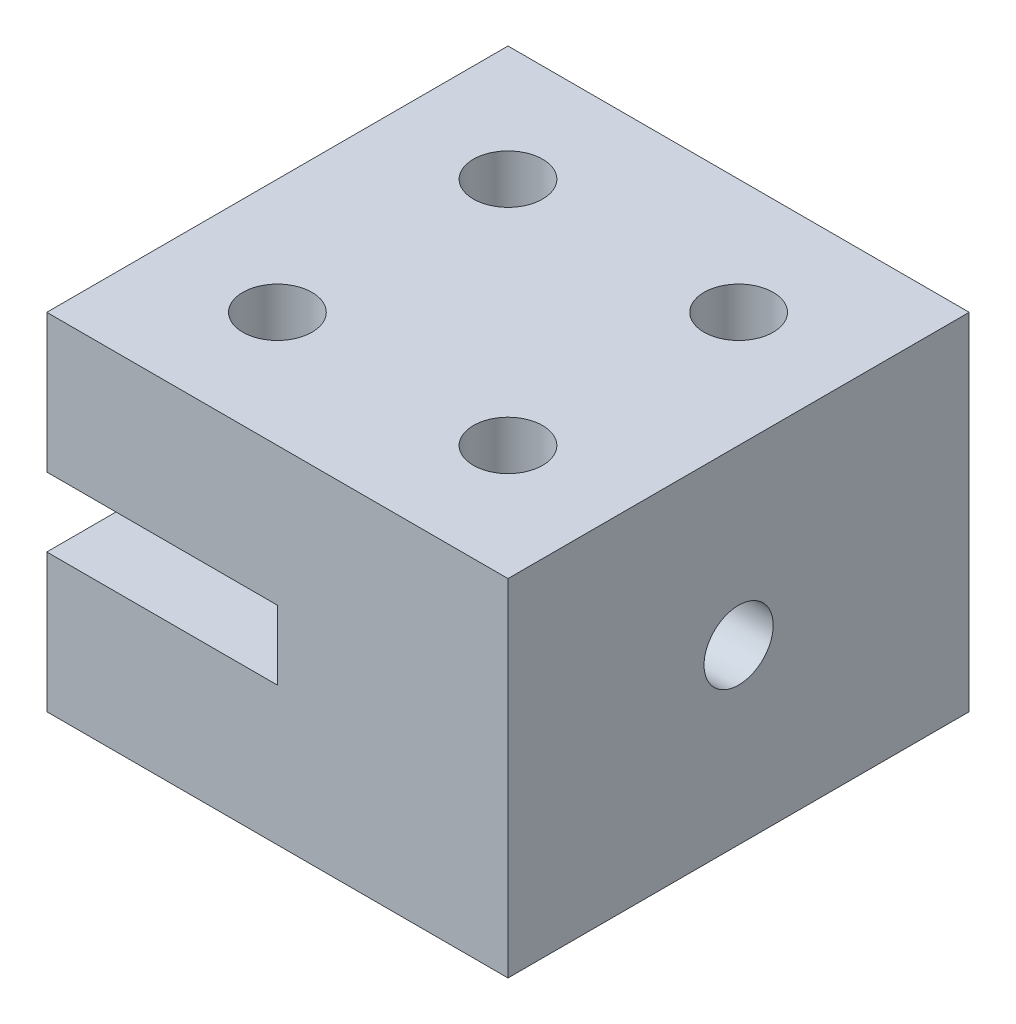
ISO-10303-21;
HEADER;
FILE_DESCRIPTION(('STEP AP214'),'2;1');
FILE_NAME('part.step','',(''),(''),'','','');
FILE_SCHEMA(('AUTOMOTIVE_DESIGN { 1 0 10303 214 1 1 1 1 }'));
ENDSEC;
DATA;
#1=APPLICATION_CONTEXT('core data for automotive mechanical design processes');
#2=APPLICATION_PROTOCOL_DEFINITION('international standard','automotive_design',2000,#1);
#3=PRODUCT_CONTEXT('',#1,'mechanical');
#4=PRODUCT('Part','Part','',(#3));
#5=PRODUCT_RELATED_PRODUCT_CATEGORY('part','',(#4));
#6=PRODUCT_DEFINITION_FORMATION('','',#4);
#7=PRODUCT_DEFINITION_CONTEXT('part definition',#1,'design');
#8=PRODUCT_DEFINITION('design','',#6,#7);
#9=PRODUCT_DEFINITION_SHAPE('','',#8);
#10=(LENGTH_UNIT() NAMED_UNIT(*) SI_UNIT(.MILLI.,.METRE.));
#11=(NAMED_UNIT(*) PLANE_ANGLE_UNIT() SI_UNIT($,.RADIAN.));
#12=(NAMED_UNIT(*) SI_UNIT($,.STERADIAN.) SOLID_ANGLE_UNIT());
#13=UNCERTAINTY_MEASURE_WITH_UNIT(LENGTH_MEASURE(1.E-05),#10,'distance_accuracy_value','');
#14=(GEOMETRIC_REPRESENTATION_CONTEXT(3) GLOBAL_UNCERTAINTY_ASSIGNED_CONTEXT((#13)) GLOBAL_UNIT_ASSIGNED_CONTEXT((#10,
#11,#12)) REPRESENTATION_CONTEXT('',''));
#15=CARTESIAN_POINT('',(0.,0.,0.));
#16=DIRECTION('',(0.,0.,1.));
#17=DIRECTION('',(1.,0.,0.));
#18=AXIS2_PLACEMENT_3D('',#15,#16,#17);
#19=CARTESIAN_POINT('',(9.99999999999999,7.5,-10.));
#20=DIRECTION('',(-1.,0.,0.));
#21=DIRECTION('',(0.,0.,1.));
#22=AXIS2_PLACEMENT_3D('',#19,#20,#21);
#23=PLANE('',#22);
#24=CARTESIAN_POINT('',(9.99999999999999,0.,0.));
#25=DIRECTION('',(1.,0.,0.));
#26=DIRECTION('',(0.,0.,-1.));
#27=AXIS2_PLACEMENT_3D('',#24,#25,#26);
#28=CIRCLE('',#27,1.5);
#29=CARTESIAN_POINT('',(9.99999999999999,0.,-1.5));
#30=VERTEX_POINT('',#29);
#31=EDGE_CURVE('E150',#30,#30,#28,.T.);
#32=ORIENTED_EDGE('',*,*,#31,.F.);
#33=EDGE_LOOP('',(#32));
#34=FACE_BOUND('',#33,.T.);
#35=DIRECTION('',(0.,-1.,0.));
#36=VECTOR('',#35,1.);
#37=CARTESIAN_POINT('',(9.99999999999999,7.5,-10.));
#38=LINE('',#37,#36);
#39=CARTESIAN_POINT('',(9.99999999999999,7.5,-10.));
#40=VERTEX_POINT('',#39);
#41=CARTESIAN_POINT('',(9.99999999999999,-7.5,-10.));
#42=VERTEX_POINT('',#41);
#43=EDGE_CURVE('E75',#40,#42,#38,.T.);
#44=ORIENTED_EDGE('',*,*,#43,.F.);
#45=DIRECTION('',(0.,0.,-1.));
#46=VECTOR('',#45,1.);
#47=CARTESIAN_POINT('',(9.99999999999999,7.5,-10.));
#48=LINE('',#47,#46);
#49=CARTESIAN_POINT('',(9.99999999999999,7.5,10.));
#50=VERTEX_POINT('',#49);
#51=EDGE_CURVE('E139',#50,#40,#48,.T.);
#52=ORIENTED_EDGE('',*,*,#51,.F.);
#53=DIRECTION('',(0.,-1.,0.));
#54=VECTOR('',#53,1.);
#55=CARTESIAN_POINT('',(9.99999999999999,7.5,10.));
#56=LINE('',#55,#54);
#57=CARTESIAN_POINT('',(9.99999999999999,-7.5,10.));
#58=VERTEX_POINT('',#57);
#59=EDGE_CURVE('E100',#50,#58,#56,.T.);
#60=ORIENTED_EDGE('',*,*,#59,.T.);
#61=DIRECTION('',(0.,0.,-1.));
#62=VECTOR('',#61,1.);
#63=CARTESIAN_POINT('',(9.99999999999999,-7.5,-10.));
#64=LINE('',#63,#62);
#65=EDGE_CURVE('E89',#58,#42,#64,.T.);
#66=ORIENTED_EDGE('',*,*,#65,.T.);
#67=EDGE_LOOP('',(#44,#52,#60,#66));
#68=FACE_BOUND('',#67,.T.);
#69=ADVANCED_FACE('F33',(#34,#68),#23,.F.);
#70=CARTESIAN_POINT('',(-10.,7.5,-10.));
#71=DIRECTION('',(0.,0.,1.));
#72=DIRECTION('',(1.,0.,0.));
#73=AXIS2_PLACEMENT_3D('',#70,#71,#72);
#74=PLANE('',#73);
#75=DIRECTION('',(-1.,0.,0.));
#76=VECTOR('',#75,1.);
#77=CARTESIAN_POINT('',(-10.,-1.5,-10.));
#78=LINE('',#77,#76);
#79=CARTESIAN_POINT('',(0.,-1.5,-10.));
#80=VERTEX_POINT('',#79);
#81=CARTESIAN_POINT('',(-10.,-1.5,-10.));
#82=VERTEX_POINT('',#81);
#83=EDGE_CURVE('E107',#80,#82,#78,.T.);
#84=ORIENTED_EDGE('',*,*,#83,.F.);
#85=DIRECTION('',(0.,-1.,0.));
#86=VECTOR('',#85,1.);
#87=CARTESIAN_POINT('',(0.,1.5,-10.));
#88=LINE('',#87,#86);
#89=CARTESIAN_POINT('',(0.,1.5,-10.));
#90=VERTEX_POINT('',#89);
#91=EDGE_CURVE('E119',#90,#80,#88,.T.);
#92=ORIENTED_EDGE('',*,*,#91,.F.);
#93=DIRECTION('',(-1.,0.,0.));
#94=VECTOR('',#93,1.);
#95=CARTESIAN_POINT('',(-10.,1.5,-10.));
#96=LINE('',#95,#94);
#97=CARTESIAN_POINT('',(-10.,1.5,-10.));
#98=VERTEX_POINT('',#97);
#99=EDGE_CURVE('E147',#90,#98,#96,.T.);
#100=ORIENTED_EDGE('',*,*,#99,.T.);
#101=DIRECTION('',(0.,-1.,0.));
#102=VECTOR('',#101,1.);
#103=CARTESIAN_POINT('',(-10.,7.5,-10.));
#104=LINE('',#103,#102);
#105=CARTESIAN_POINT('',(-10.,7.5,-10.));
#106=VERTEX_POINT('',#105);
#107=EDGE_CURVE('E124',#106,#98,#104,.T.);
#108=ORIENTED_EDGE('',*,*,#107,.F.);
#109=DIRECTION('',(-1.,0.,0.));
#110=VECTOR('',#109,1.);
#111=CARTESIAN_POINT('',(-10.,7.5,-10.));
#112=LINE('',#111,#110);
#113=EDGE_CURVE('E84',#40,#106,#112,.T.);
#114=ORIENTED_EDGE('',*,*,#113,.F.);
#115=ORIENTED_EDGE('',*,*,#43,.T.);
#116=DIRECTION('',(-1.,0.,0.));
#117=VECTOR('',#116,1.);
#118=CARTESIAN_POINT('',(-10.,-7.5,-10.));
#119=LINE('',#118,#117);
#120=CARTESIAN_POINT('',(-10.,-7.5,-10.));
#121=VERTEX_POINT('',#120);
#122=EDGE_CURVE('E79',#42,#121,#119,.T.);
#123=ORIENTED_EDGE('',*,*,#122,.T.);
#124=DIRECTION('',(0.,-1.,0.));
#125=VECTOR('',#124,1.);
#126=CARTESIAN_POINT('',(-10.,7.5,-10.));
#127=LINE('',#126,#125);
#128=EDGE_CURVE('E97',#82,#121,#127,.T.);
#129=ORIENTED_EDGE('',*,*,#128,.F.);
#130=EDGE_LOOP('',(#84,#92,#100,#108,#114,#115,#123,#129));
#131=FACE_BOUND('',#130,.T.);
#132=ADVANCED_FACE('F77',(#131),#74,.F.);
#133=CARTESIAN_POINT('',(-10.,7.5,-10.));
#134=DIRECTION('',(1.,0.,0.));
#135=DIRECTION('',(0.,0.,-1.));
#136=AXIS2_PLACEMENT_3D('',#133,#134,#135);
#137=PLANE('',#136);
#138=DIRECTION('',(0.,0.,1.));
#139=VECTOR('',#138,1.);
#140=CARTESIAN_POINT('',(-10.,-1.5,-10.));
#141=LINE('',#140,#139);
#142=CARTESIAN_POINT('',(-10.,-1.5,10.));
#143=VERTEX_POINT('',#142);
#144=EDGE_CURVE('E41',#82,#143,#141,.T.);
#145=ORIENTED_EDGE('',*,*,#144,.F.);
#146=ORIENTED_EDGE('',*,*,#128,.T.);
#147=DIRECTION('',(0.,0.,1.));
#148=VECTOR('',#147,1.);
#149=CARTESIAN_POINT('',(-10.,-7.5,-10.));
#150=LINE('',#149,#148);
#151=CARTESIAN_POINT('',(-10.,-7.5,10.));
#152=VERTEX_POINT('',#151);
#153=EDGE_CURVE('E96',#121,#152,#150,.T.);
#154=ORIENTED_EDGE('',*,*,#153,.T.);
#155=DIRECTION('',(0.,-1.,0.));
#156=VECTOR('',#155,1.);
#157=CARTESIAN_POINT('',(-10.,7.5,10.));
#158=LINE('',#157,#156);
#159=EDGE_CURVE('E111',#143,#152,#158,.T.);
#160=ORIENTED_EDGE('',*,*,#159,.F.);
#161=EDGE_LOOP('',(#145,#146,#154,#160));
#162=FACE_BOUND('',#161,.T.);
#163=ADVANCED_FACE('F226',(#162),#137,.F.);
#164=CARTESIAN_POINT('',(-10.,7.5,10.));
#165=DIRECTION('',(0.,0.,-1.));
#166=DIRECTION('',(-1.,0.,0.));
#167=AXIS2_PLACEMENT_3D('',#164,#165,#166);
#168=PLANE('',#167);
#169=DIRECTION('',(1.,0.,0.));
#170=VECTOR('',#169,1.);
#171=CARTESIAN_POINT('',(-10.,-1.5,10.));
#172=LINE('',#171,#170);
#173=CARTESIAN_POINT('',(0.,-1.5,10.));
#174=VERTEX_POINT('',#173);
#175=EDGE_CURVE('E11',#143,#174,#172,.T.);
#176=ORIENTED_EDGE('',*,*,#175,.F.);
#177=ORIENTED_EDGE('',*,*,#159,.T.);
#178=DIRECTION('',(1.,0.,0.));
#179=VECTOR('',#178,1.);
#180=CARTESIAN_POINT('',(-10.,-7.5,10.));
#181=LINE('',#180,#179);
#182=EDGE_CURVE('E108',#152,#58,#181,.T.);
#183=ORIENTED_EDGE('',*,*,#182,.T.);
#184=ORIENTED_EDGE('',*,*,#59,.F.);
#185=DIRECTION('',(1.,0.,0.));
#186=VECTOR('',#185,1.);
#187=CARTESIAN_POINT('',(-10.,7.5,10.));
#188=LINE('',#187,#186);
#189=CARTESIAN_POINT('',(-10.,7.5,10.));
#190=VERTEX_POINT('',#189);
#191=EDGE_CURVE('E132',#190,#50,#188,.T.);
#192=ORIENTED_EDGE('',*,*,#191,.F.);
#193=DIRECTION('',(0.,-1.,0.));
#194=VECTOR('',#193,1.);
#195=CARTESIAN_POINT('',(-10.,7.5,10.));
#196=LINE('',#195,#194);
#197=CARTESIAN_POINT('',(-10.,1.5,10.));
#198=VERTEX_POINT('',#197);
#199=EDGE_CURVE('E129',#190,#198,#196,.T.);
#200=ORIENTED_EDGE('',*,*,#199,.T.);
#201=DIRECTION('',(1.,0.,0.));
#202=VECTOR('',#201,1.);
#203=CARTESIAN_POINT('',(-10.,1.5,10.));
#204=LINE('',#203,#202);
#205=CARTESIAN_POINT('',(0.,1.5,10.));
#206=VERTEX_POINT('',#205);
#207=EDGE_CURVE('E141',#198,#206,#204,.T.);
#208=ORIENTED_EDGE('',*,*,#207,.T.);
#209=DIRECTION('',(0.,-1.,0.));
#210=VECTOR('',#209,1.);
#211=CARTESIAN_POINT('',(0.,1.5,10.));
#212=LINE('',#211,#210);
#213=EDGE_CURVE('E103',#206,#174,#212,.T.);
#214=ORIENTED_EDGE('',*,*,#213,.T.);
#215=EDGE_LOOP('',(#176,#177,#183,#184,#192,#200,#208,#214));
#216=FACE_BOUND('',#215,.T.);
#217=ADVANCED_FACE('F257',(#216),#168,.F.);
#218=CARTESIAN_POINT('',(0.,-7.5,0.));
#219=DIRECTION('',(0.,1.,0.));
#220=DIRECTION('',(0.,0.,1.));
#221=AXIS2_PLACEMENT_3D('',#218,#219,#220);
#222=PLANE('',#221);
#223=CARTESIAN_POINT('',(-5.,-7.5,5.));
#224=DIRECTION('',(0.,1.,0.));
#225=DIRECTION('',(0.,0.,1.));
#226=AXIS2_PLACEMENT_3D('',#223,#224,#225);
#227=CIRCLE('',#226,1.5);
#228=CARTESIAN_POINT('',(-5.,-7.5,6.5));
#229=VERTEX_POINT('',#228);
#230=EDGE_CURVE('E172',#229,#229,#227,.T.);
#231=ORIENTED_EDGE('',*,*,#230,.T.);
#232=EDGE_LOOP('',(#231));
#233=FACE_BOUND('',#232,.T.);
#234=CARTESIAN_POINT('',(5.,-7.5,5.));
#235=DIRECTION('',(0.,1.,0.));
#236=DIRECTION('',(0.,0.,1.));
#237=AXIS2_PLACEMENT_3D('',#234,#235,#236);
#238=CIRCLE('',#237,1.5);
#239=CARTESIAN_POINT('',(5.,-7.5,6.5));
#240=VERTEX_POINT('',#239);
#241=EDGE_CURVE('E179',#240,#240,#238,.T.);
#242=ORIENTED_EDGE('',*,*,#241,.T.);
#243=EDGE_LOOP('',(#242));
#244=FACE_BOUND('',#243,.T.);
#245=CARTESIAN_POINT('',(5.,-7.5,-5.));
#246=DIRECTION('',(0.,1.,0.));
#247=DIRECTION('',(0.,0.,1.));
#248=AXIS2_PLACEMENT_3D('',#245,#246,#247);
#249=CIRCLE('',#248,1.5);
#250=CARTESIAN_POINT('',(5.,-7.5,-3.5));
#251=VERTEX_POINT('',#250);
#252=EDGE_CURVE('E171',#251,#251,#249,.T.);
#253=ORIENTED_EDGE('',*,*,#252,.T.);
#254=EDGE_LOOP('',(#253));
#255=FACE_BOUND('',#254,.T.);
#256=CARTESIAN_POINT('',(-5.,-7.5,-5.));
#257=DIRECTION('',(0.,1.,0.));
#258=DIRECTION('',(0.,0.,1.));
#259=AXIS2_PLACEMENT_3D('',#256,#257,#258);
#260=CIRCLE('',#259,1.5);
#261=CARTESIAN_POINT('',(-5.,-7.5,-3.5));
#262=VERTEX_POINT('',#261);
#263=EDGE_CURVE('E165',#262,#262,#260,.T.);
#264=ORIENTED_EDGE('',*,*,#263,.T.);
#265=EDGE_LOOP('',(#264));
#266=FACE_BOUND('',#265,.T.);
#267=ORIENTED_EDGE('',*,*,#65,.F.);
#268=ORIENTED_EDGE('',*,*,#182,.F.);
#269=ORIENTED_EDGE('',*,*,#153,.F.);
#270=ORIENTED_EDGE('',*,*,#122,.F.);
#271=EDGE_LOOP('',(#267,#268,#269,#270));
#272=FACE_BOUND('',#271,.T.);
#273=ADVANCED_FACE('F93',(#233,#244,#255,#266,#272),#222,.F.);
#274=CARTESIAN_POINT('',(0.,-1.5,0.));
#275=DIRECTION('',(0.,1.,0.));
#276=DIRECTION('',(0.,0.,1.));
#277=AXIS2_PLACEMENT_3D('',#274,#275,#276);
#278=PLANE('',#277);
#279=CARTESIAN_POINT('',(-5.,-1.5,5.));
#280=DIRECTION('',(0.,1.,0.));
#281=DIRECTION('',(0.,0.,1.));
#282=AXIS2_PLACEMENT_3D('',#279,#280,#281);
#283=CIRCLE('',#282,1.5);
#284=CARTESIAN_POINT('',(-5.,-1.5,6.5));
#285=VERTEX_POINT('',#284);
#286=EDGE_CURVE('E153',#285,#285,#283,.T.);
#287=ORIENTED_EDGE('',*,*,#286,.F.);
#288=EDGE_LOOP('',(#287));
#289=FACE_BOUND('',#288,.T.);
#290=CARTESIAN_POINT('',(-5.,-1.5,-5.));
#291=DIRECTION('',(0.,1.,0.));
#292=DIRECTION('',(0.,0.,1.));
#293=AXIS2_PLACEMENT_3D('',#290,#291,#292);
#294=CIRCLE('',#293,1.5);
#295=CARTESIAN_POINT('',(-5.,-1.5,-3.5));
#296=VERTEX_POINT('',#295);
#297=EDGE_CURVE('E159',#296,#296,#294,.T.);
#298=ORIENTED_EDGE('',*,*,#297,.F.);
#299=EDGE_LOOP('',(#298));
#300=FACE_BOUND('',#299,.T.);
#301=DIRECTION('',(0.,0.,1.));
#302=VECTOR('',#301,1.);
#303=CARTESIAN_POINT('',(0.,-1.5,-10.));
#304=LINE('',#303,#302);
#305=EDGE_CURVE('E48',#80,#174,#304,.T.);
#306=ORIENTED_EDGE('',*,*,#305,.F.);
#307=ORIENTED_EDGE('',*,*,#83,.T.);
#308=ORIENTED_EDGE('',*,*,#144,.T.);
#309=ORIENTED_EDGE('',*,*,#175,.T.);
#310=EDGE_LOOP('',(#306,#307,#308,#309));
#311=FACE_BOUND('',#310,.T.);
#312=ADVANCED_FACE('F253',(#289,#300,#311),#278,.T.);
#313=CARTESIAN_POINT('',(0.,1.5,-10.));
#314=DIRECTION('',(1.,0.,0.));
#315=DIRECTION('',(0.,0.,-1.));
#316=AXIS2_PLACEMENT_3D('',#313,#314,#315);
#317=PLANE('',#316);
#318=ORIENTED_EDGE('',*,*,#305,.T.);
#319=ORIENTED_EDGE('',*,*,#213,.F.);
#320=DIRECTION('',(0.,0.,1.));
#321=VECTOR('',#320,1.);
#322=CARTESIAN_POINT('',(0.,1.5,-10.));
#323=LINE('',#322,#321);
#324=EDGE_CURVE('E122',#90,#206,#323,.T.);
#325=ORIENTED_EDGE('',*,*,#324,.F.);
#326=ORIENTED_EDGE('',*,*,#91,.T.);
#327=EDGE_LOOP('',(#318,#319,#325,#326));
#328=FACE_BOUND('',#327,.T.);
#329=ADVANCED_FACE('F246',(#328),#317,.F.);
#330=CARTESIAN_POINT('',(0.,1.5,0.));
#331=DIRECTION('',(0.,1.,0.));
#332=DIRECTION('',(0.,0.,1.));
#333=AXIS2_PLACEMENT_3D('',#330,#331,#332);
#334=PLANE('',#333);
#335=CARTESIAN_POINT('',(-5.,1.5,5.));
#336=DIRECTION('',(0.,1.,0.));
#337=DIRECTION('',(0.,0.,1.));
#338=AXIS2_PLACEMENT_3D('',#335,#336,#337);
#339=CIRCLE('',#338,1.5);
#340=CARTESIAN_POINT('',(-5.,1.5,6.5));
#341=VERTEX_POINT('',#340);
#342=EDGE_CURVE('E156',#341,#341,#339,.T.);
#343=ORIENTED_EDGE('',*,*,#342,.T.);
#344=EDGE_LOOP('',(#343));
#345=FACE_BOUND('',#344,.T.);
#346=CARTESIAN_POINT('',(-5.,1.5,-5.));
#347=DIRECTION('',(0.,1.,0.));
#348=DIRECTION('',(0.,0.,1.));
#349=AXIS2_PLACEMENT_3D('',#346,#347,#348);
#350=CIRCLE('',#349,1.5);
#351=CARTESIAN_POINT('',(-5.,1.5,-3.5));
#352=VERTEX_POINT('',#351);
#353=EDGE_CURVE('E162',#352,#352,#350,.T.);
#354=ORIENTED_EDGE('',*,*,#353,.T.);
#355=EDGE_LOOP('',(#354));
#356=FACE_BOUND('',#355,.T.);
#357=ORIENTED_EDGE('',*,*,#99,.F.);
#358=ORIENTED_EDGE('',*,*,#324,.T.);
#359=ORIENTED_EDGE('',*,*,#207,.F.);
#360=DIRECTION('',(0.,0.,1.));
#361=VECTOR('',#360,1.);
#362=CARTESIAN_POINT('',(-10.,1.5,-10.));
#363=LINE('',#362,#361);
#364=EDGE_CURVE('E144',#98,#198,#363,.T.);
#365=ORIENTED_EDGE('',*,*,#364,.F.);
#366=EDGE_LOOP('',(#357,#358,#359,#365));
#367=FACE_BOUND('',#366,.T.);
#368=ADVANCED_FACE('F243',(#345,#356,#367),#334,.F.);
#369=CARTESIAN_POINT('',(0.,7.5,0.));
#370=DIRECTION('',(0.,1.,0.));
#371=DIRECTION('',(0.,0.,1.));
#372=AXIS2_PLACEMENT_3D('',#369,#370,#371);
#373=PLANE('',#372);
#374=CARTESIAN_POINT('',(-5.,7.5,5.));
#375=DIRECTION('',(0.,1.,0.));
#376=DIRECTION('',(0.,0.,1.));
#377=AXIS2_PLACEMENT_3D('',#374,#375,#376);
#378=CIRCLE('',#377,1.5);
#379=CARTESIAN_POINT('',(-5.,7.5,6.5));
#380=VERTEX_POINT('',#379);
#381=EDGE_CURVE('E176',#380,#380,#378,.T.);
#382=ORIENTED_EDGE('',*,*,#381,.F.);
#383=EDGE_LOOP('',(#382));
#384=FACE_BOUND('',#383,.T.);
#385=CARTESIAN_POINT('',(5.,7.5,5.));
#386=DIRECTION('',(0.,1.,0.));
#387=DIRECTION('',(0.,0.,1.));
#388=AXIS2_PLACEMENT_3D('',#385,#386,#387);
#389=CIRCLE('',#388,1.5);
#390=CARTESIAN_POINT('',(5.,7.5,6.5));
#391=VERTEX_POINT('',#390);
#392=EDGE_CURVE('E175',#391,#391,#389,.T.);
#393=ORIENTED_EDGE('',*,*,#392,.F.);
#394=EDGE_LOOP('',(#393));
#395=FACE_BOUND('',#394,.T.);
#396=CARTESIAN_POINT('',(5.,7.5,-5.));
#397=DIRECTION('',(0.,1.,0.));
#398=DIRECTION('',(0.,0.,1.));
#399=AXIS2_PLACEMENT_3D('',#396,#397,#398);
#400=CIRCLE('',#399,1.5);
#401=CARTESIAN_POINT('',(5.,7.5,-3.5));
#402=VERTEX_POINT('',#401);
#403=EDGE_CURVE('E182',#402,#402,#400,.T.);
#404=ORIENTED_EDGE('',*,*,#403,.F.);
#405=EDGE_LOOP('',(#404));
#406=FACE_BOUND('',#405,.T.);
#407=CARTESIAN_POINT('',(-5.,7.5,-5.));
#408=DIRECTION('',(0.,1.,0.));
#409=DIRECTION('',(0.,0.,1.));
#410=AXIS2_PLACEMENT_3D('',#407,#408,#409);
#411=CIRCLE('',#410,1.5);
#412=CARTESIAN_POINT('',(-5.,7.5,-3.5));
#413=VERTEX_POINT('',#412);
#414=EDGE_CURVE('E168',#413,#413,#411,.T.);
#415=ORIENTED_EDGE('',*,*,#414,.F.);
#416=EDGE_LOOP('',(#415));
#417=FACE_BOUND('',#416,.T.);
#418=ORIENTED_EDGE('',*,*,#51,.T.);
#419=ORIENTED_EDGE('',*,*,#113,.T.);
#420=DIRECTION('',(0.,0.,1.));
#421=VECTOR('',#420,1.);
#422=CARTESIAN_POINT('',(-10.,7.5,-10.));
#423=LINE('',#422,#421);
#424=EDGE_CURVE('E135',#106,#190,#423,.T.);
#425=ORIENTED_EDGE('',*,*,#424,.T.);
#426=ORIENTED_EDGE('',*,*,#191,.T.);
#427=EDGE_LOOP('',(#418,#419,#425,#426));
#428=FACE_BOUND('',#427,.T.);
#429=ADVANCED_FACE('F239',(#384,#395,#406,#417,#428),#373,.T.);
#430=CARTESIAN_POINT('',(-10.,7.5,-10.));
#431=DIRECTION('',(1.,0.,0.));
#432=DIRECTION('',(0.,0.,-1.));
#433=AXIS2_PLACEMENT_3D('',#430,#431,#432);
#434=PLANE('',#433);
#435=ORIENTED_EDGE('',*,*,#107,.T.);
#436=ORIENTED_EDGE('',*,*,#364,.T.);
#437=ORIENTED_EDGE('',*,*,#199,.F.);
#438=ORIENTED_EDGE('',*,*,#424,.F.);
#439=EDGE_LOOP('',(#435,#436,#437,#438));
#440=FACE_BOUND('',#439,.T.);
#441=ADVANCED_FACE('F230',(#440),#434,.F.);
#442=CARTESIAN_POINT('',(4.99999999999999,0.,0.));
#443=DIRECTION('',(1.,0.,0.));
#444=DIRECTION('',(0.,0.,-1.));
#445=AXIS2_PLACEMENT_3D('',#442,#443,#444);
#446=CYLINDRICAL_SURFACE('',#445,1.5);
#447=CARTESIAN_POINT('',(6.24999999999999,0.,0.));
#448=DIRECTION('',(1.,0.,0.));
#449=DIRECTION('',(0.,0.,-1.));
#450=AXIS2_PLACEMENT_3D('',#447,#448,#449);
#451=CIRCLE('',#450,1.5);
#452=CARTESIAN_POINT('',(6.24999999999999,0.,-1.5));
#453=VERTEX_POINT('',#452);
#454=EDGE_CURVE('E36',#453,#453,#451,.F.);
#455=ORIENTED_EDGE('',*,*,#454,.T.);
#456=EDGE_LOOP('',(#455));
#457=FACE_BOUND('',#456,.T.);
#458=ORIENTED_EDGE('',*,*,#31,.T.);
#459=EDGE_LOOP('',(#458));
#460=FACE_BOUND('',#459,.T.);
#461=ADVANCED_FACE('F199',(#457,#460),#446,.F.);
#462=CARTESIAN_POINT('',(-5.,-7.5,-5.));
#463=DIRECTION('',(0.,1.,0.));
#464=DIRECTION('',(0.,0.,1.));
#465=AXIS2_PLACEMENT_3D('',#462,#463,#464);
#466=CYLINDRICAL_SURFACE('',#465,1.5);
#467=ORIENTED_EDGE('',*,*,#414,.T.);
#468=EDGE_LOOP('',(#467));
#469=FACE_BOUND('',#468,.T.);
#470=ORIENTED_EDGE('',*,*,#353,.F.);
#471=EDGE_LOOP('',(#470));
#472=FACE_BOUND('',#471,.T.);
#473=ADVANCED_FACE('F229',(#469,#472),#466,.F.);
#474=CARTESIAN_POINT('',(5.,-7.5,-5.));
#475=DIRECTION('',(0.,1.,0.));
#476=DIRECTION('',(0.,0.,1.));
#477=AXIS2_PLACEMENT_3D('',#474,#475,#476);
#478=CYLINDRICAL_SURFACE('',#477,1.5);
#479=ORIENTED_EDGE('',*,*,#252,.F.);
#480=EDGE_LOOP('',(#479));
#481=FACE_BOUND('',#480,.T.);
#482=ORIENTED_EDGE('',*,*,#403,.T.);
#483=EDGE_LOOP('',(#482));
#484=FACE_BOUND('',#483,.T.);
#485=ADVANCED_FACE('F236',(#481,#484),#478,.F.);
#486=CARTESIAN_POINT('',(5.,-7.5,5.));
#487=DIRECTION('',(0.,1.,0.));
#488=DIRECTION('',(0.,0.,1.));
#489=AXIS2_PLACEMENT_3D('',#486,#487,#488);
#490=CYLINDRICAL_SURFACE('',#489,1.5);
#491=ORIENTED_EDGE('',*,*,#241,.F.);
#492=EDGE_LOOP('',(#491));
#493=FACE_BOUND('',#492,.T.);
#494=ORIENTED_EDGE('',*,*,#392,.T.);
#495=EDGE_LOOP('',(#494));
#496=FACE_BOUND('',#495,.T.);
#497=ADVANCED_FACE('F362',(#493,#496),#490,.F.);
#498=CARTESIAN_POINT('',(-5.,-7.5,5.));
#499=DIRECTION('',(0.,1.,0.));
#500=DIRECTION('',(0.,0.,1.));
#501=AXIS2_PLACEMENT_3D('',#498,#499,#500);
#502=CYLINDRICAL_SURFACE('',#501,1.5);
#503=ORIENTED_EDGE('',*,*,#381,.T.);
#504=EDGE_LOOP('',(#503));
#505=FACE_BOUND('',#504,.T.);
#506=ORIENTED_EDGE('',*,*,#342,.F.);
#507=EDGE_LOOP('',(#506));
#508=FACE_BOUND('',#507,.T.);
#509=ADVANCED_FACE('F218',(#505,#508),#502,.F.);
#510=ORIENTED_EDGE('',*,*,#297,.T.);
#511=EDGE_LOOP('',(#510));
#512=FACE_BOUND('',#511,.T.);
#513=ORIENTED_EDGE('',*,*,#263,.F.);
#514=EDGE_LOOP('',(#513));
#515=FACE_BOUND('',#514,.T.);
#516=ADVANCED_FACE('F215',(#512,#515),#466,.F.);
#517=ORIENTED_EDGE('',*,*,#286,.T.);
#518=EDGE_LOOP('',(#517));
#519=FACE_BOUND('',#518,.T.);
#520=ORIENTED_EDGE('',*,*,#230,.F.);
#521=EDGE_LOOP('',(#520));
#522=FACE_BOUND('',#521,.T.);
#523=ADVANCED_FACE('F205',(#519,#522),#502,.F.);
#524=CARTESIAN_POINT('',(6.24999999999999,0.,0.));
#525=DIRECTION('',(1.,0.,0.));
#526=DIRECTION('',(0.,0.,-1.));
#527=AXIS2_PLACEMENT_3D('',#524,#525,#526);
#528=PLANE('',#527);
#529=CARTESIAN_POINT('',(6.24999999999999,0.,0.));
#530=DIRECTION('',(1.,0.,0.));
#531=DIRECTION('',(0.,0.,-1.));
#532=AXIS2_PLACEMENT_3D('',#529,#530,#531);
#533=CIRCLE('',#532,3.);
#534=CARTESIAN_POINT('',(6.24999999999999,0.,-3.));
#535=VERTEX_POINT('',#534);
#536=EDGE_CURVE('E189',#535,#535,#533,.T.);
#537=ORIENTED_EDGE('',*,*,#536,.F.);
#538=EDGE_LOOP('',(#537));
#539=FACE_BOUND('',#538,.T.);
#540=ORIENTED_EDGE('',*,*,#454,.F.);
#541=EDGE_LOOP('',(#540));
#542=FACE_BOUND('',#541,.T.);
#543=ADVANCED_FACE('F202',(#539,#542),#528,.F.);
#544=CARTESIAN_POINT('',(3.74999999999999,0.,0.));
#545=DIRECTION('',(1.,0.,0.));
#546=DIRECTION('',(0.,0.,-1.));
#547=AXIS2_PLACEMENT_3D('',#544,#545,#546);
#548=CYLINDRICAL_SURFACE('',#547,3.);
#549=CARTESIAN_POINT('',(3.74999999999999,0.,0.));
#550=DIRECTION('',(1.,0.,0.));
#551=DIRECTION('',(0.,0.,-1.));
#552=AXIS2_PLACEMENT_3D('',#549,#550,#551);
#553=CIRCLE('',#552,3.);
#554=CARTESIAN_POINT('',(3.74999999999999,0.,-3.));
#555=VERTEX_POINT('',#554);
#556=EDGE_CURVE('E192',#555,#555,#553,.T.);
#557=ORIENTED_EDGE('',*,*,#556,.F.);
#558=EDGE_LOOP('',(#557));
#559=FACE_BOUND('',#558,.T.);
#560=ORIENTED_EDGE('',*,*,#536,.T.);
#561=EDGE_LOOP('',(#560));
#562=FACE_BOUND('',#561,.T.);
#563=ADVANCED_FACE('F204',(#559,#562),#548,.F.);
#564=CARTESIAN_POINT('',(3.74999999999999,0.,0.));
#565=DIRECTION('',(1.,0.,0.));
#566=DIRECTION('',(0.,0.,-1.));
#567=AXIS2_PLACEMENT_3D('',#564,#565,#566);
#568=PLANE('',#567);
#569=ORIENTED_EDGE('',*,*,#556,.T.);
#570=EDGE_LOOP('',(#569));
#571=FACE_BOUND('',#570,.T.);
#572=ADVANCED_FACE('F212',(#571),#568,.T.);
#573=CLOSED_SHELL('',(#69,#132,#163,#217,#273,#312,#329,#368,#429,#441,#461,#473,#485,#497,#509,
#516,#523,#543,#563,#572));
#574=MANIFOLD_SOLID_BREP('B2',#573);
#575=ADVANCED_BREP_SHAPE_REPRESENTATION('',(#18,#574),#14);
#576=SHAPE_DEFINITION_REPRESENTATION(#9,#575);
ENDSEC;
END-ISO-10303-21;
